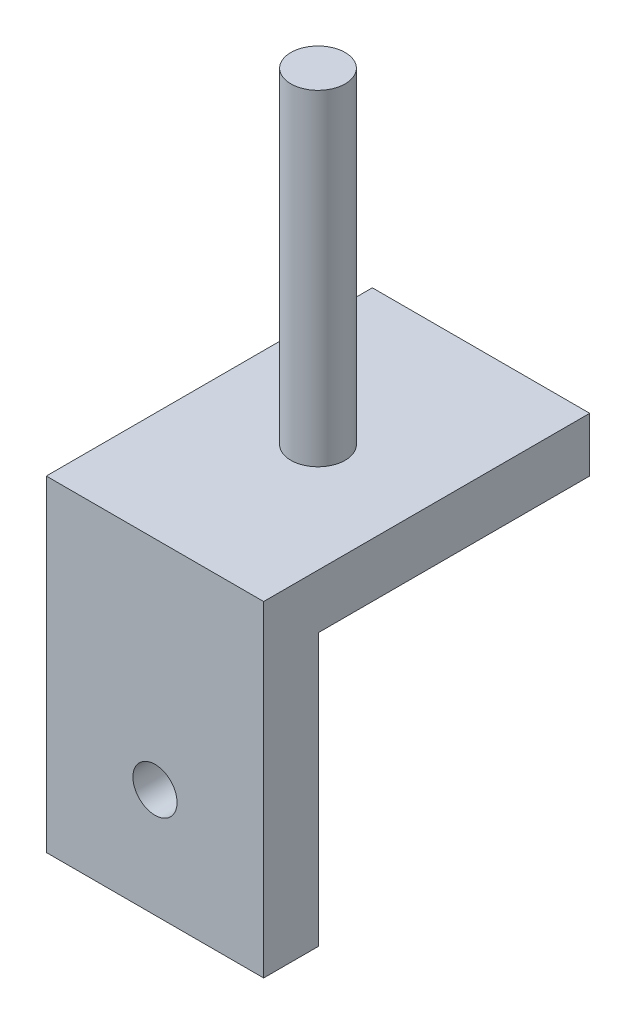
ISO-10303-21;
HEADER;
FILE_DESCRIPTION(('STEP AP214'),'2;1');
FILE_NAME('part.step','',(''),(''),'','','');
FILE_SCHEMA(('AUTOMOTIVE_DESIGN { 1 0 10303 214 1 1 1 1 }'));
ENDSEC;
DATA;
#1=APPLICATION_CONTEXT('core data for automotive mechanical design processes');
#2=APPLICATION_PROTOCOL_DEFINITION('international standard','automotive_design',2000,#1);
#3=PRODUCT_CONTEXT('',#1,'mechanical');
#4=PRODUCT('Part','Part','',(#3));
#5=PRODUCT_RELATED_PRODUCT_CATEGORY('part','',(#4));
#6=PRODUCT_DEFINITION_FORMATION('','',#4);
#7=PRODUCT_DEFINITION_CONTEXT('part definition',#1,'design');
#8=PRODUCT_DEFINITION('design','',#6,#7);
#9=PRODUCT_DEFINITION_SHAPE('','',#8);
#10=(LENGTH_UNIT() NAMED_UNIT(*) SI_UNIT(.MILLI.,.METRE.));
#11=(NAMED_UNIT(*) PLANE_ANGLE_UNIT() SI_UNIT($,.RADIAN.));
#12=(NAMED_UNIT(*) SI_UNIT($,.STERADIAN.) SOLID_ANGLE_UNIT());
#13=UNCERTAINTY_MEASURE_WITH_UNIT(LENGTH_MEASURE(1.E-05),#10,'distance_accuracy_value','');
#14=(GEOMETRIC_REPRESENTATION_CONTEXT(3) GLOBAL_UNCERTAINTY_ASSIGNED_CONTEXT((#13)) GLOBAL_UNIT_ASSIGNED_CONTEXT((#10,
#11,#12)) REPRESENTATION_CONTEXT('',''));
#15=CARTESIAN_POINT('',(0.,0.,0.));
#16=DIRECTION('',(0.,0.,1.));
#17=DIRECTION('',(1.,0.,0.));
#18=AXIS2_PLACEMENT_3D('',#15,#16,#17);
#19=CARTESIAN_POINT('',(25.4,12.7,-38.1));
#20=DIRECTION('',(-1.,0.,0.));
#21=DIRECTION('',(0.,0.,1.));
#22=AXIS2_PLACEMENT_3D('',#19,#20,#21);
#23=PLANE('',#22);
#24=DIRECTION('',(0.,-1.,0.));
#25=VECTOR('',#24,1.);
#26=CARTESIAN_POINT('',(25.4,12.7,-38.1));
#27=LINE('',#26,#25);
#28=CARTESIAN_POINT('',(25.4,12.7,-38.1));
#29=VERTEX_POINT('',#28);
#30=CARTESIAN_POINT('',(25.4,0.,-38.1));
#31=VERTEX_POINT('',#30);
#32=EDGE_CURVE('E54',#29,#31,#27,.T.);
#33=ORIENTED_EDGE('',*,*,#32,.F.);
#34=DIRECTION('',(0.,0.,-1.));
#35=VECTOR('',#34,1.);
#36=CARTESIAN_POINT('',(25.4,12.7,-38.1));
#37=LINE('',#36,#35);
#38=CARTESIAN_POINT('',(25.4,12.7,38.1));
#39=VERTEX_POINT('',#38);
#40=EDGE_CURVE('E100',#39,#29,#37,.T.);
#41=ORIENTED_EDGE('',*,*,#40,.F.);
#42=DIRECTION('',(0.,-1.,0.));
#43=VECTOR('',#42,1.);
#44=CARTESIAN_POINT('',(25.4,12.7,38.1));
#45=LINE('',#44,#43);
#46=CARTESIAN_POINT('',(25.4,-63.5,38.1));
#47=VERTEX_POINT('',#46);
#48=EDGE_CURVE('E121',#39,#47,#45,.T.);
#49=ORIENTED_EDGE('',*,*,#48,.T.);
#50=DIRECTION('',(0.,0.,-1.));
#51=VECTOR('',#50,1.);
#52=CARTESIAN_POINT('',(25.4,-63.5,38.1));
#53=LINE('',#52,#51);
#54=CARTESIAN_POINT('',(25.4,-63.5,25.2919616765057));
#55=VERTEX_POINT('',#54);
#56=EDGE_CURVE('E158',#47,#55,#53,.T.);
#57=ORIENTED_EDGE('',*,*,#56,.T.);
#58=DIRECTION('',(0.,1.,0.));
#59=VECTOR('',#58,1.);
#60=CARTESIAN_POINT('',(25.4,-63.5,25.2919616765057));
#61=LINE('',#60,#59);
#62=CARTESIAN_POINT('',(25.4,0.,25.2919616765057));
#63=VERTEX_POINT('',#62);
#64=EDGE_CURVE('E150',#55,#63,#61,.T.);
#65=ORIENTED_EDGE('',*,*,#64,.T.);
#66=DIRECTION('',(0.,0.,-1.));
#67=VECTOR('',#66,1.);
#68=CARTESIAN_POINT('',(25.4,0.,-38.1));
#69=LINE('',#68,#67);
#70=EDGE_CURVE('E74',#63,#31,#69,.T.);
#71=ORIENTED_EDGE('',*,*,#70,.T.);
#72=EDGE_LOOP('',(#33,#41,#49,#57,#65,#71));
#73=FACE_BOUND('',#72,.T.);
#74=ADVANCED_FACE('F45',(#73),#23,.F.);
#75=CARTESIAN_POINT('',(-25.4,12.7,-38.1));
#76=DIRECTION('',(0.,0.,1.));
#77=DIRECTION('',(1.,0.,0.));
#78=AXIS2_PLACEMENT_3D('',#75,#76,#77);
#79=PLANE('',#78);
#80=DIRECTION('',(-1.,0.,0.));
#81=VECTOR('',#80,1.);
#82=CARTESIAN_POINT('',(-25.4,0.,-38.1));
#83=LINE('',#82,#81);
#84=CARTESIAN_POINT('',(-25.4,0.,-38.1));
#85=VERTEX_POINT('',#84);
#86=EDGE_CURVE('E108',#31,#85,#83,.T.);
#87=ORIENTED_EDGE('',*,*,#86,.T.);
#88=DIRECTION('',(0.,-1.,0.));
#89=VECTOR('',#88,1.);
#90=CARTESIAN_POINT('',(-25.4,12.7,-38.1));
#91=LINE('',#90,#89);
#92=CARTESIAN_POINT('',(-25.4,12.7,-38.1));
#93=VERTEX_POINT('',#92);
#94=EDGE_CURVE('E106',#93,#85,#91,.T.);
#95=ORIENTED_EDGE('',*,*,#94,.F.);
#96=DIRECTION('',(-1.,0.,0.));
#97=VECTOR('',#96,1.);
#98=CARTESIAN_POINT('',(-25.4,12.7,-38.1));
#99=LINE('',#98,#97);
#100=EDGE_CURVE('E92',#29,#93,#99,.T.);
#101=ORIENTED_EDGE('',*,*,#100,.F.);
#102=ORIENTED_EDGE('',*,*,#32,.T.);
#103=EDGE_LOOP('',(#87,#95,#101,#102));
#104=FACE_BOUND('',#103,.T.);
#105=ADVANCED_FACE('F107',(#104),#79,.F.);
#106=CARTESIAN_POINT('',(-25.4,12.7,-38.1));
#107=DIRECTION('',(1.,0.,0.));
#108=DIRECTION('',(0.,0.,-1.));
#109=AXIS2_PLACEMENT_3D('',#106,#107,#108);
#110=PLANE('',#109);
#111=DIRECTION('',(0.,0.,1.));
#112=VECTOR('',#111,1.);
#113=CARTESIAN_POINT('',(-25.4,0.,-38.1));
#114=LINE('',#113,#112);
#115=CARTESIAN_POINT('',(-25.4,0.,25.2919616765057));
#116=VERTEX_POINT('',#115);
#117=EDGE_CURVE('E130',#85,#116,#114,.T.);
#118=ORIENTED_EDGE('',*,*,#117,.T.);
#119=DIRECTION('',(0.,1.,0.));
#120=VECTOR('',#119,1.);
#121=CARTESIAN_POINT('',(-25.4,-63.5,25.2919616765057));
#122=LINE('',#121,#120);
#123=CARTESIAN_POINT('',(-25.4,-63.5,25.2919616765057));
#124=VERTEX_POINT('',#123);
#125=EDGE_CURVE('E85',#124,#116,#122,.T.);
#126=ORIENTED_EDGE('',*,*,#125,.F.);
#127=DIRECTION('',(0.,0.,1.));
#128=VECTOR('',#127,1.);
#129=CARTESIAN_POINT('',(-25.4,-63.5,38.1));
#130=LINE('',#129,#128);
#131=CARTESIAN_POINT('',(-25.4,-63.5,38.1));
#132=VERTEX_POINT('',#131);
#133=EDGE_CURVE('E165',#124,#132,#130,.T.);
#134=ORIENTED_EDGE('',*,*,#133,.T.);
#135=DIRECTION('',(0.,-1.,0.));
#136=VECTOR('',#135,1.);
#137=CARTESIAN_POINT('',(-25.4,12.7,38.1));
#138=LINE('',#137,#136);
#139=CARTESIAN_POINT('',(-25.4,12.7,38.1));
#140=VERTEX_POINT('',#139);
#141=EDGE_CURVE('E113',#140,#132,#138,.T.);
#142=ORIENTED_EDGE('',*,*,#141,.F.);
#143=DIRECTION('',(0.,0.,1.));
#144=VECTOR('',#143,1.);
#145=CARTESIAN_POINT('',(-25.4,12.7,-38.1));
#146=LINE('',#145,#144);
#147=EDGE_CURVE('E97',#93,#140,#146,.T.);
#148=ORIENTED_EDGE('',*,*,#147,.F.);
#149=ORIENTED_EDGE('',*,*,#94,.T.);
#150=EDGE_LOOP('',(#118,#126,#134,#142,#148,#149));
#151=FACE_BOUND('',#150,.T.);
#152=ADVANCED_FACE('F115',(#151),#110,.F.);
#153=CARTESIAN_POINT('',(-25.4,12.7,38.1));
#154=DIRECTION('',(0.,0.,-1.));
#155=DIRECTION('',(-1.,0.,0.));
#156=AXIS2_PLACEMENT_3D('',#153,#154,#155);
#157=PLANE('',#156);
#158=CARTESIAN_POINT('',(0.,-38.1,38.1));
#159=DIRECTION('',(0.,0.,-1.));
#160=DIRECTION('',(-1.,0.,0.));
#161=AXIS2_PLACEMENT_3D('',#158,#159,#160);
#162=CIRCLE('',#161,5.159375);
#163=CARTESIAN_POINT('',(-5.159375,-38.1,38.1));
#164=VERTEX_POINT('',#163);
#165=EDGE_CURVE('E168',#164,#164,#162,.T.);
#166=ORIENTED_EDGE('',*,*,#165,.T.);
#167=EDGE_LOOP('',(#166));
#168=FACE_BOUND('',#167,.T.);
#169=ORIENTED_EDGE('',*,*,#141,.T.);
#170=DIRECTION('',(1.,0.,0.));
#171=VECTOR('',#170,1.);
#172=CARTESIAN_POINT('',(-25.4,-63.5,38.1));
#173=LINE('',#172,#171);
#174=EDGE_CURVE('E161',#132,#47,#173,.T.);
#175=ORIENTED_EDGE('',*,*,#174,.T.);
#176=ORIENTED_EDGE('',*,*,#48,.F.);
#177=DIRECTION('',(1.,0.,0.));
#178=VECTOR('',#177,1.);
#179=CARTESIAN_POINT('',(-25.4,12.7,38.1));
#180=LINE('',#179,#178);
#181=EDGE_CURVE('E62',#140,#39,#180,.T.);
#182=ORIENTED_EDGE('',*,*,#181,.F.);
#183=EDGE_LOOP('',(#169,#175,#176,#182));
#184=FACE_BOUND('',#183,.T.);
#185=ADVANCED_FACE('F199',(#168,#184),#157,.F.);
#186=CARTESIAN_POINT('',(0.,12.7,0.));
#187=DIRECTION('',(0.,1.,0.));
#188=DIRECTION('',(0.,0.,1.));
#189=AXIS2_PLACEMENT_3D('',#186,#187,#188);
#190=PLANE('',#189);
#191=ORIENTED_EDGE('',*,*,#147,.T.);
#192=ORIENTED_EDGE('',*,*,#181,.T.);
#193=ORIENTED_EDGE('',*,*,#40,.T.);
#194=ORIENTED_EDGE('',*,*,#100,.T.);
#195=EDGE_LOOP('',(#191,#192,#193,#194));
#196=FACE_BOUND('',#195,.T.);
#197=CARTESIAN_POINT('',(0.,12.7,0.));
#198=DIRECTION('',(0.,1.,0.));
#199=DIRECTION('',(0.,0.,1.));
#200=AXIS2_PLACEMENT_3D('',#197,#198,#199);
#201=CIRCLE('',#200,6.35);
#202=CARTESIAN_POINT('',(0.,12.7,-6.35));
#203=VERTEX_POINT('',#202);
#204=EDGE_CURVE('E143',#203,#203,#201,.T.);
#205=ORIENTED_EDGE('',*,*,#204,.F.);
#206=EDGE_LOOP('',(#205));
#207=FACE_BOUND('',#206,.T.);
#208=ADVANCED_FACE('F94',(#196,#207),#190,.T.);
#209=CARTESIAN_POINT('',(0.,0.,0.));
#210=DIRECTION('',(0.,1.,0.));
#211=DIRECTION('',(0.,0.,1.));
#212=AXIS2_PLACEMENT_3D('',#209,#210,#211);
#213=PLANE('',#212);
#214=ORIENTED_EDGE('',*,*,#70,.F.);
#215=DIRECTION('',(-1.,0.,0.));
#216=VECTOR('',#215,1.);
#217=CARTESIAN_POINT('',(0.,0.,25.2919616765057));
#218=LINE('',#217,#216);
#219=EDGE_CURVE('E11',#63,#116,#218,.T.);
#220=ORIENTED_EDGE('',*,*,#219,.T.);
#221=ORIENTED_EDGE('',*,*,#117,.F.);
#222=ORIENTED_EDGE('',*,*,#86,.F.);
#223=EDGE_LOOP('',(#214,#220,#221,#222));
#224=FACE_BOUND('',#223,.T.);
#225=ADVANCED_FACE('F192',(#224),#213,.F.);
#226=CARTESIAN_POINT('',(0.,88.9,0.));
#227=DIRECTION('',(0.,-1.,0.));
#228=DIRECTION('',(0.,0.,-1.));
#229=AXIS2_PLACEMENT_3D('',#226,#227,#228);
#230=CYLINDRICAL_SURFACE('',#229,6.35);
#231=CARTESIAN_POINT('',(0.,88.9,0.));
#232=DIRECTION('',(0.,1.,0.));
#233=DIRECTION('',(0.,0.,1.));
#234=AXIS2_PLACEMENT_3D('',#231,#232,#233);
#235=CIRCLE('',#234,6.35);
#236=CARTESIAN_POINT('',(0.,88.9,-6.35));
#237=VERTEX_POINT('',#236);
#238=EDGE_CURVE('E127',#237,#237,#235,.T.);
#239=CARTESIAN_POINT('',(0.,88.9,-6.35));
#240=CARTESIAN_POINT('',(0.,88.10625,-6.35));
#241=CARTESIAN_POINT('',(0.,87.3125,-6.35));
#242=CARTESIAN_POINT('',(0.,85.725,-6.35));
#243=CARTESIAN_POINT('',(0.,84.93125,-6.35));
#244=CARTESIAN_POINT('',(0.,83.34375,-6.35));
#245=CARTESIAN_POINT('',(0.,82.55,-6.35));
#246=CARTESIAN_POINT('',(0.,80.9625,-6.35));
#247=CARTESIAN_POINT('',(0.,80.16875,-6.35));
#248=CARTESIAN_POINT('',(0.,78.58125,-6.35));
#249=CARTESIAN_POINT('',(0.,77.7875,-6.35));
#250=CARTESIAN_POINT('',(0.,76.2,-6.35));
#251=CARTESIAN_POINT('',(0.,75.40625,-6.35));
#252=CARTESIAN_POINT('',(0.,73.81875,-6.35));
#253=CARTESIAN_POINT('',(0.,73.025,-6.35));
#254=CARTESIAN_POINT('',(0.,71.4375,-6.35));
#255=CARTESIAN_POINT('',(0.,70.64375,-6.35));
#256=CARTESIAN_POINT('',(0.,69.05625,-6.35));
#257=CARTESIAN_POINT('',(0.,68.2625,-6.35));
#258=CARTESIAN_POINT('',(0.,66.675,-6.35));
#259=CARTESIAN_POINT('',(0.,65.88125,-6.35));
#260=CARTESIAN_POINT('',(0.,64.29375,-6.35));
#261=CARTESIAN_POINT('',(0.,63.5,-6.35));
#262=CARTESIAN_POINT('',(0.,61.9125,-6.35));
#263=CARTESIAN_POINT('',(0.,61.11875,-6.35));
#264=CARTESIAN_POINT('',(0.,59.53125,-6.35));
#265=CARTESIAN_POINT('',(0.,58.7375,-6.35));
#266=CARTESIAN_POINT('',(0.,57.15,-6.35));
#267=CARTESIAN_POINT('',(0.,56.35625,-6.35));
#268=CARTESIAN_POINT('',(0.,54.76875,-6.35));
#269=CARTESIAN_POINT('',(0.,53.975,-6.35));
#270=CARTESIAN_POINT('',(0.,52.3875,-6.35));
#271=CARTESIAN_POINT('',(0.,51.59375,-6.35));
#272=CARTESIAN_POINT('',(0.,50.00625,-6.35));
#273=CARTESIAN_POINT('',(0.,49.2125,-6.35));
#274=CARTESIAN_POINT('',(0.,47.625,-6.35));
#275=CARTESIAN_POINT('',(0.,46.83125,-6.35));
#276=CARTESIAN_POINT('',(0.,45.24375,-6.35));
#277=CARTESIAN_POINT('',(0.,44.45,-6.35));
#278=CARTESIAN_POINT('',(0.,42.8625,-6.35));
#279=CARTESIAN_POINT('',(0.,42.06875,-6.35));
#280=CARTESIAN_POINT('',(0.,40.48125,-6.35));
#281=CARTESIAN_POINT('',(0.,39.6875,-6.35));
#282=CARTESIAN_POINT('',(0.,38.1,-6.35));
#283=CARTESIAN_POINT('',(0.,37.30625,-6.35));
#284=CARTESIAN_POINT('',(0.,35.71875,-6.35));
#285=CARTESIAN_POINT('',(0.,34.925,-6.35));
#286=CARTESIAN_POINT('',(0.,33.3375,-6.35));
#287=CARTESIAN_POINT('',(0.,32.54375,-6.35));
#288=CARTESIAN_POINT('',(0.,30.95625,-6.35));
#289=CARTESIAN_POINT('',(0.,30.1625,-6.35));
#290=CARTESIAN_POINT('',(0.,28.575,-6.35));
#291=CARTESIAN_POINT('',(0.,27.78125,-6.35));
#292=CARTESIAN_POINT('',(0.,26.19375,-6.35));
#293=CARTESIAN_POINT('',(0.,25.4,-6.35));
#294=CARTESIAN_POINT('',(0.,23.8125,-6.35));
#295=CARTESIAN_POINT('',(0.,23.01875,-6.35));
#296=CARTESIAN_POINT('',(0.,21.43125,-6.35));
#297=CARTESIAN_POINT('',(0.,20.6375,-6.35));
#298=CARTESIAN_POINT('',(0.,19.05,-6.35));
#299=CARTESIAN_POINT('',(0.,18.25625,-6.35));
#300=CARTESIAN_POINT('',(0.,16.66875,-6.35));
#301=CARTESIAN_POINT('',(0.,15.875,-6.35));
#302=CARTESIAN_POINT('',(0.,14.2875,-6.35));
#303=CARTESIAN_POINT('',(0.,13.49375,-6.35));
#304=CARTESIAN_POINT('',(0.,12.7,-6.35));
#305=B_SPLINE_CURVE_WITH_KNOTS('',3,(#239,#240,#241,#242,#243,#244,#245,#246,#247,#248,#249,
#250,#251,#252,#253,#254,#255,#256,#257,#258,#259,#260,#261,#262,#263,#264,#265,#266,#267,#268,
#269,#270,#271,#272,#273,#274,#275,#276,#277,#278,#279,#280,#281,#282,#283,#284,#285,#286,#287,
#288,#289,#290,#291,#292,#293,#294,#295,#296,#297,#298,#299,#300,#301,#302,#303,#304),
.UNSPECIFIED.,.F.,.F.,(4,2,2,2,2,2,2,2,2,2,2,2,2,2,2,2,2,2,2,2,2,2,2,2,2,2,2,2,2,2,2,2,4),(0.,
2.38124999999999,4.76249999999999,7.14374999999999,9.52499999999999,11.90625,14.2875,16.66875,
19.05,21.43125,23.8125,26.19375,28.575,30.95625,33.3375,35.71875,38.1,40.48125,42.8625,45.24375,
47.625,50.00625,52.3875,54.76875,57.15,59.53125,61.9125,64.29375,66.675,69.05625,71.4375,
73.81875,76.2),.UNSPECIFIED.);
#306=EDGE_CURVE('BSEAM226',#237,#203,#305,.T.);
#307=ORIENTED_EDGE('',*,*,#238,.F.);
#308=ORIENTED_EDGE('',*,*,#204,.T.);
#309=ORIENTED_EDGE('',*,*,#306,.T.);
#310=ORIENTED_EDGE('',*,*,#306,.F.);
#311=EDGE_LOOP('',(#307,#309,#308,#310));
#312=FACE_BOUND('',#311,.T.);
#313=ADVANCED_FACE('F226',(#312),#230,.T.);
#314=CARTESIAN_POINT('',(0.,88.9,0.));
#315=DIRECTION('',(0.,1.,0.));
#316=DIRECTION('',(0.,0.,1.));
#317=AXIS2_PLACEMENT_3D('',#314,#315,#316);
#318=PLANE('',#317);
#319=ORIENTED_EDGE('',*,*,#238,.T.);
#320=EDGE_LOOP('',(#319));
#321=FACE_BOUND('',#320,.T.);
#322=ADVANCED_FACE('F186',(#321),#318,.T.);
#323=CARTESIAN_POINT('',(-25.4,-63.5,25.2919616765057));
#324=DIRECTION('',(0.,0.,-1.));
#325=DIRECTION('',(-1.,0.,0.));
#326=AXIS2_PLACEMENT_3D('',#323,#324,#325);
#327=PLANE('',#326);
#328=CARTESIAN_POINT('',(0.,-38.1,25.2919616765057));
#329=DIRECTION('',(0.,0.,-1.));
#330=DIRECTION('',(-1.,0.,0.));
#331=AXIS2_PLACEMENT_3D('',#328,#329,#330);
#332=CIRCLE('',#331,5.794375);
#333=CARTESIAN_POINT('',(-5.794375,-38.1,25.2919616765057));
#334=VERTEX_POINT('',#333);
#335=EDGE_CURVE('E176',#334,#334,#332,.T.);
#336=ORIENTED_EDGE('',*,*,#335,.F.);
#337=EDGE_LOOP('',(#336));
#338=FACE_BOUND('',#337,.T.);
#339=ORIENTED_EDGE('',*,*,#219,.F.);
#340=ORIENTED_EDGE('',*,*,#64,.F.);
#341=DIRECTION('',(-1.,0.,0.));
#342=VECTOR('',#341,1.);
#343=CARTESIAN_POINT('',(-25.4,-63.5,25.2919616765057));
#344=LINE('',#343,#342);
#345=EDGE_CURVE('E153',#55,#124,#344,.T.);
#346=ORIENTED_EDGE('',*,*,#345,.T.);
#347=ORIENTED_EDGE('',*,*,#125,.T.);
#348=EDGE_LOOP('',(#339,#340,#346,#347));
#349=FACE_BOUND('',#348,.T.);
#350=ADVANCED_FACE('F183',(#338,#349),#327,.T.);
#351=CARTESIAN_POINT('',(0.,-63.5,0.));
#352=DIRECTION('',(0.,-1.,0.));
#353=DIRECTION('',(0.,0.,-1.));
#354=AXIS2_PLACEMENT_3D('',#351,#352,#353);
#355=PLANE('',#354);
#356=ORIENTED_EDGE('',*,*,#133,.F.);
#357=ORIENTED_EDGE('',*,*,#345,.F.);
#358=ORIENTED_EDGE('',*,*,#56,.F.);
#359=ORIENTED_EDGE('',*,*,#174,.F.);
#360=EDGE_LOOP('',(#356,#357,#358,#359));
#361=FACE_BOUND('',#360,.T.);
#362=ADVANCED_FACE('F185',(#361),#355,.T.);
#363=CARTESIAN_POINT('',(0.,-38.1,25.2919616765057));
#364=DIRECTION('',(0.,0.,-1.));
#365=DIRECTION('',(-1.,0.,0.));
#366=AXIS2_PLACEMENT_3D('',#363,#364,#365);
#367=CYLINDRICAL_SURFACE('',#366,5.15937499999999);
#368=ORIENTED_EDGE('',*,*,#165,.F.);
#369=EDGE_LOOP('',(#368));
#370=FACE_BOUND('',#369,.T.);
#371=CARTESIAN_POINT('',(0.,-38.1,25.9269616765057));
#372=DIRECTION('',(0.,0.,-1.));
#373=DIRECTION('',(-1.,0.,0.));
#374=AXIS2_PLACEMENT_3D('',#371,#372,#373);
#375=CIRCLE('',#374,5.15937499999999);
#376=CARTESIAN_POINT('',(-5.15937499999999,-38.1,25.9269616765057));
#377=VERTEX_POINT('',#376);
#378=EDGE_CURVE('E172',#377,#377,#375,.T.);
#379=ORIENTED_EDGE('',*,*,#378,.T.);
#380=EDGE_LOOP('',(#379));
#381=FACE_BOUND('',#380,.T.);
#382=ADVANCED_FACE('F274',(#370,#381),#367,.F.);
#383=CARTESIAN_POINT('',(0.,-38.1,25.2919616765057));
#384=DIRECTION('',(0.,0.,-1.));
#385=DIRECTION('',(-1.,0.,0.));
#386=AXIS2_PLACEMENT_3D('',#383,#384,#385);
#387=CONICAL_SURFACE('',#386,5.794375,0.78539816339745);
#388=ORIENTED_EDGE('',*,*,#378,.F.);
#389=EDGE_LOOP('',(#388));
#390=FACE_BOUND('',#389,.T.);
#391=ORIENTED_EDGE('',*,*,#335,.T.);
#392=EDGE_LOOP('',(#391));
#393=FACE_BOUND('',#392,.T.);
#394=ADVANCED_FACE('F181',(#390,#393),#387,.F.);
#395=CLOSED_SHELL('',(#74,#105,#152,#185,#208,#225,#313,#322,#350,#362,#382,#394));
#396=MANIFOLD_SOLID_BREP('B2',#395);
#397=ADVANCED_BREP_SHAPE_REPRESENTATION('',(#18,#396),#14);
#398=SHAPE_DEFINITION_REPRESENTATION(#9,#397);
ENDSEC;
END-ISO-10303-21;
